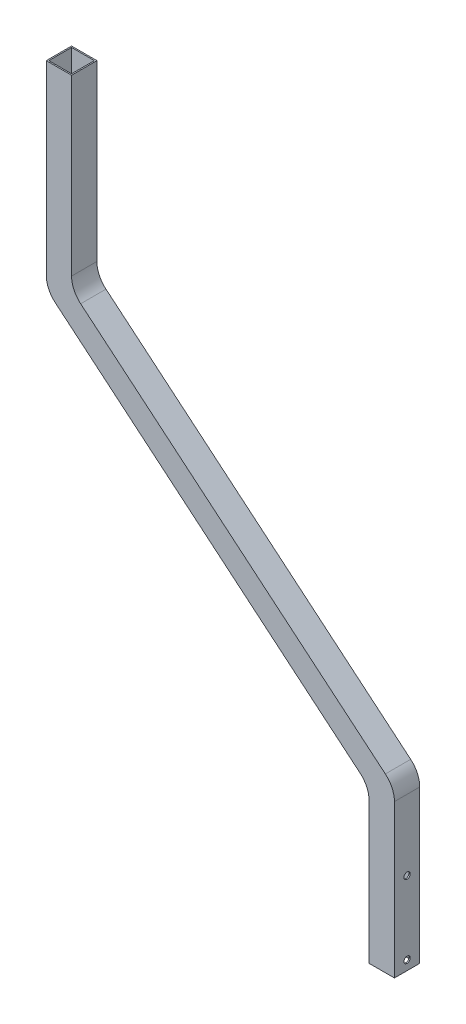
ISO-10303-21;
HEADER;
FILE_DESCRIPTION(('STEP AP214'),'2;1');
FILE_NAME('part.step','',(''),(''),'','','');
FILE_SCHEMA(('AUTOMOTIVE_DESIGN { 1 0 10303 214 1 1 1 1 }'));
ENDSEC;
DATA;
#1=APPLICATION_CONTEXT('core data for automotive mechanical design processes');
#2=APPLICATION_PROTOCOL_DEFINITION('international standard','automotive_design',2000,#1);
#3=PRODUCT_CONTEXT('',#1,'mechanical');
#4=PRODUCT('Part','Part','',(#3));
#5=PRODUCT_RELATED_PRODUCT_CATEGORY('part','',(#4));
#6=PRODUCT_DEFINITION_FORMATION('','',#4);
#7=PRODUCT_DEFINITION_CONTEXT('part definition',#1,'design');
#8=PRODUCT_DEFINITION('design','',#6,#7);
#9=PRODUCT_DEFINITION_SHAPE('','',#8);
#10=(LENGTH_UNIT() NAMED_UNIT(*) SI_UNIT(.MILLI.,.METRE.));
#11=(NAMED_UNIT(*) PLANE_ANGLE_UNIT() SI_UNIT($,.RADIAN.));
#12=(NAMED_UNIT(*) SI_UNIT($,.STERADIAN.) SOLID_ANGLE_UNIT());
#13=UNCERTAINTY_MEASURE_WITH_UNIT(LENGTH_MEASURE(1.E-05),#10,'distance_accuracy_value','');
#14=(GEOMETRIC_REPRESENTATION_CONTEXT(3) GLOBAL_UNCERTAINTY_ASSIGNED_CONTEXT((#13)) GLOBAL_UNIT_ASSIGNED_CONTEXT((#10,
#11,#12)) REPRESENTATION_CONTEXT('',''));
#15=CARTESIAN_POINT('',(0.,0.,0.));
#16=DIRECTION('',(0.,0.,1.));
#17=DIRECTION('',(1.,0.,0.));
#18=AXIS2_PLACEMENT_3D('',#15,#16,#17);
#19=CARTESIAN_POINT('',(-647.7,1244.6,50.8));
#20=DIRECTION('',(0.,-1.,0.));
#21=DIRECTION('',(1.,0.,0.));
#22=AXIS2_PLACEMENT_3D('',#19,#20,#21);
#23=PLANE('',#22);
#24=DIRECTION('',(-1.,0.,0.));
#25=VECTOR('',#24,1.);
#26=CARTESIAN_POINT('',(-647.7,1244.6,0.));
#27=LINE('',#26,#25);
#28=CARTESIAN_POINT('',(-647.7,1244.6,0.));
#29=VERTEX_POINT('',#28);
#30=CARTESIAN_POINT('',(-698.5,1244.6,0.));
#31=VERTEX_POINT('',#30);
#32=EDGE_CURVE('E333',#29,#31,#27,.T.);
#33=ORIENTED_EDGE('',*,*,#32,.T.);
#34=DIRECTION('',(0.,0.,-1.));
#35=VECTOR('',#34,1.);
#36=CARTESIAN_POINT('',(-698.5,1244.6,50.8));
#37=LINE('',#36,#35);
#38=CARTESIAN_POINT('',(-698.5,1244.6,50.8));
#39=VERTEX_POINT('',#38);
#40=EDGE_CURVE('E344',#39,#31,#37,.T.);
#41=ORIENTED_EDGE('',*,*,#40,.F.);
#42=DIRECTION('',(-1.,0.,0.));
#43=VECTOR('',#42,1.);
#44=CARTESIAN_POINT('',(-647.7,1244.6,50.8));
#45=LINE('',#44,#43);
#46=CARTESIAN_POINT('',(-647.7,1244.6,50.8));
#47=VERTEX_POINT('',#46);
#48=EDGE_CURVE('E312',#47,#39,#45,.T.);
#49=ORIENTED_EDGE('',*,*,#48,.F.);
#50=DIRECTION('',(0.,0.,-1.));
#51=VECTOR('',#50,1.);
#52=CARTESIAN_POINT('',(-647.7,1244.6,50.8));
#53=LINE('',#52,#51);
#54=EDGE_CURVE('E347',#47,#29,#53,.T.);
#55=ORIENTED_EDGE('',*,*,#54,.T.);
#56=EDGE_LOOP('',(#33,#41,#49,#55));
#57=FACE_BOUND('',#56,.T.);
#58=DIRECTION('',(-1.,0.,0.));
#59=VECTOR('',#58,1.);
#60=CARTESIAN_POINT('',(-647.7,1244.6,2.54));
#61=LINE('',#60,#59);
#62=CARTESIAN_POINT('',(-650.24,1244.6,2.54));
#63=VERTEX_POINT('',#62);
#64=CARTESIAN_POINT('',(-695.96,1244.6,2.54));
#65=VERTEX_POINT('',#64);
#66=EDGE_CURVE('E282',#63,#65,#61,.T.);
#67=ORIENTED_EDGE('',*,*,#66,.F.);
#68=DIRECTION('',(0.,0.,-1.));
#69=VECTOR('',#68,1.);
#70=CARTESIAN_POINT('',(-650.24,1244.6,50.8));
#71=LINE('',#70,#69);
#72=CARTESIAN_POINT('',(-650.24,1244.6,48.26));
#73=VERTEX_POINT('',#72);
#74=EDGE_CURVE('E293',#73,#63,#71,.T.);
#75=ORIENTED_EDGE('',*,*,#74,.F.);
#76=DIRECTION('',(-1.,0.,0.));
#77=VECTOR('',#76,1.);
#78=CARTESIAN_POINT('',(-647.7,1244.6,48.26));
#79=LINE('',#78,#77);
#80=CARTESIAN_POINT('',(-695.96,1244.6,48.26));
#81=VERTEX_POINT('',#80);
#82=EDGE_CURVE('E61',#73,#81,#79,.T.);
#83=ORIENTED_EDGE('',*,*,#82,.T.);
#84=DIRECTION('',(0.,0.,-1.));
#85=VECTOR('',#84,1.);
#86=CARTESIAN_POINT('',(-695.96,1244.6,50.8));
#87=LINE('',#86,#85);
#88=EDGE_CURVE('E211',#81,#65,#87,.T.);
#89=ORIENTED_EDGE('',*,*,#88,.T.);
#90=EDGE_LOOP('',(#67,#75,#83,#89));
#91=FACE_BOUND('',#90,.T.);
#92=ADVANCED_FACE('F37',(#57,#91),#23,.F.);
#93=CARTESIAN_POINT('',(-50.8,0.,50.8));
#94=DIRECTION('',(0.,1.,0.));
#95=DIRECTION('',(0.,0.,1.));
#96=AXIS2_PLACEMENT_3D('',#93,#94,#95);
#97=PLANE('',#96);
#98=DIRECTION('',(-1.,0.,0.));
#99=VECTOR('',#98,1.);
#100=CARTESIAN_POINT('',(-2.54,0.,48.26));
#101=LINE('',#100,#99);
#102=CARTESIAN_POINT('',(-2.54,0.,48.26));
#103=VERTEX_POINT('',#102);
#104=CARTESIAN_POINT('',(-48.26,0.,48.26));
#105=VERTEX_POINT('',#104);
#106=EDGE_CURVE('E215',#103,#105,#101,.T.);
#107=ORIENTED_EDGE('',*,*,#106,.F.);
#108=DIRECTION('',(0.,0.,1.));
#109=VECTOR('',#108,1.);
#110=CARTESIAN_POINT('',(-2.54,0.,2.54));
#111=LINE('',#110,#109);
#112=CARTESIAN_POINT('',(-2.54,0.,2.54));
#113=VERTEX_POINT('',#112);
#114=EDGE_CURVE('E219',#113,#103,#111,.T.);
#115=ORIENTED_EDGE('',*,*,#114,.F.);
#116=DIRECTION('',(1.,0.,0.));
#117=VECTOR('',#116,1.);
#118=CARTESIAN_POINT('',(-2.54,0.,2.54));
#119=LINE('',#118,#117);
#120=CARTESIAN_POINT('',(-48.26,0.,2.54));
#121=VERTEX_POINT('',#120);
#122=EDGE_CURVE('E224',#121,#113,#119,.T.);
#123=ORIENTED_EDGE('',*,*,#122,.F.);
#124=DIRECTION('',(0.,0.,-1.));
#125=VECTOR('',#124,1.);
#126=CARTESIAN_POINT('',(-48.26,0.,2.54));
#127=LINE('',#126,#125);
#128=EDGE_CURVE('E206',#105,#121,#127,.T.);
#129=ORIENTED_EDGE('',*,*,#128,.F.);
#130=EDGE_LOOP('',(#107,#115,#123,#129));
#131=FACE_BOUND('',#130,.T.);
#132=DIRECTION('',(1.,0.,0.));
#133=VECTOR('',#132,1.);
#134=CARTESIAN_POINT('',(-50.8,0.,0.));
#135=LINE('',#134,#133);
#136=CARTESIAN_POINT('',(-50.8,0.,0.));
#137=VERTEX_POINT('',#136);
#138=CARTESIAN_POINT('',(0.,0.,0.));
#139=VERTEX_POINT('',#138);
#140=EDGE_CURVE('E248',#137,#139,#135,.T.);
#141=ORIENTED_EDGE('',*,*,#140,.T.);
#142=DIRECTION('',(0.,0.,-1.));
#143=VECTOR('',#142,1.);
#144=CARTESIAN_POINT('',(0.,0.,50.8));
#145=LINE('',#144,#143);
#146=CARTESIAN_POINT('',(0.,0.,50.8));
#147=VERTEX_POINT('',#146);
#148=EDGE_CURVE('E350',#147,#139,#145,.T.);
#149=ORIENTED_EDGE('',*,*,#148,.F.);
#150=DIRECTION('',(1.,0.,0.));
#151=VECTOR('',#150,1.);
#152=CARTESIAN_POINT('',(-50.8,0.,50.8));
#153=LINE('',#152,#151);
#154=CARTESIAN_POINT('',(-50.8,0.,50.8));
#155=VERTEX_POINT('',#154);
#156=EDGE_CURVE('E300',#155,#147,#153,.T.);
#157=ORIENTED_EDGE('',*,*,#156,.F.);
#158=DIRECTION('',(0.,0.,-1.));
#159=VECTOR('',#158,1.);
#160=CARTESIAN_POINT('',(-50.8,0.,50.8));
#161=LINE('',#160,#159);
#162=EDGE_CURVE('E322',#155,#137,#161,.T.);
#163=ORIENTED_EDGE('',*,*,#162,.T.);
#164=EDGE_LOOP('',(#141,#149,#157,#163));
#165=FACE_BOUND('',#164,.T.);
#166=ADVANCED_FACE('F221',(#131,#165),#97,.F.);
#167=CARTESIAN_POINT('',(0.,0.,50.8));
#168=DIRECTION('',(-1.,0.,0.));
#169=DIRECTION('',(0.,0.,1.));
#170=AXIS2_PLACEMENT_3D('',#167,#168,#169);
#171=PLANE('',#170);
#172=CARTESIAN_POINT('',(0.,19.05,25.4));
#173=DIRECTION('',(1.,0.,0.));
#174=DIRECTION('',(0.,0.,-1.));
#175=AXIS2_PLACEMENT_3D('',#172,#173,#174);
#176=CIRCLE('',#175,6.34999999999999);
#177=CARTESIAN_POINT('',(0.,19.05,19.05));
#178=VERTEX_POINT('',#177);
#179=EDGE_CURVE('E393',#178,#178,#176,.T.);
#180=ORIENTED_EDGE('',*,*,#179,.F.);
#181=EDGE_LOOP('',(#180));
#182=FACE_BOUND('',#181,.T.);
#183=CARTESIAN_POINT('',(0.,165.1,25.4));
#184=DIRECTION('',(1.,0.,0.));
#185=DIRECTION('',(0.,0.,-1.));
#186=AXIS2_PLACEMENT_3D('',#183,#184,#185);
#187=CIRCLE('',#186,6.34999999999999);
#188=CARTESIAN_POINT('',(0.,165.1,19.05));
#189=VERTEX_POINT('',#188);
#190=EDGE_CURVE('E389',#189,#189,#187,.T.);
#191=ORIENTED_EDGE('',*,*,#190,.F.);
#192=EDGE_LOOP('',(#191));
#193=FACE_BOUND('',#192,.T.);
#194=DIRECTION('',(0.,1.,0.));
#195=VECTOR('',#194,1.);
#196=CARTESIAN_POINT('',(0.,0.,0.));
#197=LINE('',#196,#195);
#198=CARTESIAN_POINT('',(0.,306.461836950665,0.));
#199=VERTEX_POINT('',#198);
#200=EDGE_CURVE('E325',#139,#199,#197,.T.);
#201=ORIENTED_EDGE('',*,*,#200,.T.);
#202=DIRECTION('',(0.,0.,-1.));
#203=VECTOR('',#202,1.);
#204=CARTESIAN_POINT('',(0.,306.461836950665,50.8));
#205=LINE('',#204,#203);
#206=CARTESIAN_POINT('',(0.,306.461836950665,50.8));
#207=VERTEX_POINT('',#206);
#208=EDGE_CURVE('E370',#199,#207,#205,.F.);
#209=ORIENTED_EDGE('',*,*,#208,.T.);
#210=DIRECTION('',(0.,1.,0.));
#211=VECTOR('',#210,1.);
#212=CARTESIAN_POINT('',(0.,0.,50.8));
#213=LINE('',#212,#211);
#214=EDGE_CURVE('E303',#147,#207,#213,.T.);
#215=ORIENTED_EDGE('',*,*,#214,.F.);
#216=ORIENTED_EDGE('',*,*,#148,.T.);
#217=EDGE_LOOP('',(#201,#209,#215,#216));
#218=FACE_BOUND('',#217,.T.);
#219=ADVANCED_FACE('F467',(#182,#193,#218),#171,.F.);
#220=CARTESIAN_POINT('',(0.,330.2,50.8));
#221=DIRECTION('',(-0.641555200491106,-0.76707687015241,0.));
#222=DIRECTION('',(0.76707687015241,-0.641555200491106,0.));
#223=AXIS2_PLACEMENT_3D('',#220,#221,#222);
#224=PLANE('',#223);
#225=DIRECTION('',(-0.76707687015241,0.641555200491106,0.));
#226=VECTOR('',#225,1.);
#227=CARTESIAN_POINT('',(0.,330.2,50.8));
#228=LINE('',#227,#226);
#229=CARTESIAN_POINT('',(-18.2089958150518,345.429341954407,50.8));
#230=VERTEX_POINT('',#229);
#231=CARTESIAN_POINT('',(-629.491004184948,856.68338531832,50.8));
#232=VERTEX_POINT('',#231);
#233=EDGE_CURVE('E307',#230,#232,#228,.T.);
#234=ORIENTED_EDGE('',*,*,#233,.F.);
#235=DIRECTION('',(0.,0.,-1.));
#236=VECTOR('',#235,1.);
#237=CARTESIAN_POINT('',(-18.2089958150518,345.429341954407,50.8));
#238=LINE('',#237,#236);
#239=CARTESIAN_POINT('',(-18.2089958150518,345.429341954407,0.));
#240=VERTEX_POINT('',#239);
#241=EDGE_CURVE('E363',#230,#240,#238,.T.);
#242=ORIENTED_EDGE('',*,*,#241,.T.);
#243=DIRECTION('',(-0.76707687015241,0.641555200491106,0.));
#244=VECTOR('',#243,1.);
#245=CARTESIAN_POINT('',(0.,330.2,0.));
#246=LINE('',#245,#244);
#247=CARTESIAN_POINT('',(-629.491004184948,856.68338531832,0.));
#248=VERTEX_POINT('',#247);
#249=EDGE_CURVE('E328',#240,#248,#246,.T.);
#250=ORIENTED_EDGE('',*,*,#249,.T.);
#251=DIRECTION('',(0.,0.,-1.));
#252=VECTOR('',#251,1.);
#253=CARTESIAN_POINT('',(-629.491004184948,856.68338531832,50.8));
#254=LINE('',#253,#252);
#255=EDGE_CURVE('E361',#248,#232,#254,.F.);
#256=ORIENTED_EDGE('',*,*,#255,.T.);
#257=EDGE_LOOP('',(#234,#242,#250,#256));
#258=FACE_BOUND('',#257,.T.);
#259=ADVANCED_FACE('F476',(#258),#224,.F.);
#260=CARTESIAN_POINT('',(-647.7,871.912727272727,50.8));
#261=DIRECTION('',(-1.,0.,0.));
#262=DIRECTION('',(0.,0.,1.));
#263=AXIS2_PLACEMENT_3D('',#260,#261,#262);
#264=PLANE('',#263);
#265=DIRECTION('',(0.,1.,0.));
#266=VECTOR('',#265,1.);
#267=CARTESIAN_POINT('',(-647.7,871.912727272727,50.8));
#268=LINE('',#267,#266);
#269=CARTESIAN_POINT('',(-647.7,895.650890322063,50.8));
#270=VERTEX_POINT('',#269);
#271=EDGE_CURVE('E310',#270,#47,#268,.T.);
#272=ORIENTED_EDGE('',*,*,#271,.F.);
#273=DIRECTION('',(0.,0.,-1.));
#274=VECTOR('',#273,1.);
#275=CARTESIAN_POINT('',(-647.7,895.650890322063,0.));
#276=LINE('',#275,#274);
#277=CARTESIAN_POINT('',(-647.7,895.650890322063,0.));
#278=VERTEX_POINT('',#277);
#279=EDGE_CURVE('E376',#270,#278,#276,.T.);
#280=ORIENTED_EDGE('',*,*,#279,.T.);
#281=DIRECTION('',(0.,1.,0.));
#282=VECTOR('',#281,1.);
#283=CARTESIAN_POINT('',(-647.7,871.912727272727,0.));
#284=LINE('',#283,#282);
#285=EDGE_CURVE('E331',#278,#29,#284,.T.);
#286=ORIENTED_EDGE('',*,*,#285,.T.);
#287=ORIENTED_EDGE('',*,*,#54,.F.);
#288=EDGE_LOOP('',(#272,#280,#286,#287));
#289=FACE_BOUND('',#288,.T.);
#290=ADVANCED_FACE('F473',(#289),#264,.F.);
#291=CARTESIAN_POINT('',(-698.5,848.174564223392,50.8));
#292=DIRECTION('',(1.,0.,0.));
#293=DIRECTION('',(0.,1.,0.));
#294=AXIS2_PLACEMENT_3D('',#291,#292,#293);
#295=PLANE('',#294);
#296=DIRECTION('',(0.,-1.,0.));
#297=VECTOR('',#296,1.);
#298=CARTESIAN_POINT('',(-698.5,848.174564223392,0.));
#299=LINE('',#298,#297);
#300=CARTESIAN_POINT('',(-698.5,871.912727272727,0.));
#301=VERTEX_POINT('',#300);
#302=EDGE_CURVE('E335',#31,#301,#299,.T.);
#303=ORIENTED_EDGE('',*,*,#302,.T.);
#304=DIRECTION('',(0.,0.,-1.));
#305=VECTOR('',#304,1.);
#306=CARTESIAN_POINT('',(-698.5,871.912727272727,50.8));
#307=LINE('',#306,#305);
#308=CARTESIAN_POINT('',(-698.5,871.912727272727,50.8));
#309=VERTEX_POINT('',#308);
#310=EDGE_CURVE('E379',#301,#309,#307,.F.);
#311=ORIENTED_EDGE('',*,*,#310,.T.);
#312=DIRECTION('',(0.,-1.,0.));
#313=VECTOR('',#312,1.);
#314=CARTESIAN_POINT('',(-698.5,848.174564223392,50.8));
#315=LINE('',#314,#313);
#316=EDGE_CURVE('E314',#39,#309,#315,.T.);
#317=ORIENTED_EDGE('',*,*,#316,.F.);
#318=ORIENTED_EDGE('',*,*,#40,.T.);
#319=EDGE_LOOP('',(#303,#311,#317,#318));
#320=FACE_BOUND('',#319,.T.);
#321=ADVANCED_FACE('F471',(#320),#295,.F.);
#322=CARTESIAN_POINT('',(-50.8,306.461836950665,50.8));
#323=DIRECTION('',(0.641555200491106,0.76707687015241,0.));
#324=DIRECTION('',(-0.76707687015241,0.641555200491106,0.));
#325=AXIS2_PLACEMENT_3D('',#322,#323,#324);
#326=PLANE('',#325);
#327=CARTESIAN_POINT('',(-582.872241675592,751.467711806614,25.4));
#328=DIRECTION('',(-0.641555200491106,-0.76707687015241,0.));
#329=DIRECTION('',(0.76707687015241,-0.641555200491106,0.));
#330=AXIS2_PLACEMENT_3D('',#327,#328,#329);
#331=CIRCLE('',#330,6.34999999999999);
#332=CARTESIAN_POINT('',(-578.001303550124,747.393836283495,25.4));
#333=VERTEX_POINT('',#332);
#334=EDGE_CURVE('E404',#333,#333,#331,.T.);
#335=ORIENTED_EDGE('',*,*,#334,.F.);
#336=EDGE_LOOP('',(#335));
#337=FACE_BOUND('',#336,.T.);
#338=DIRECTION('',(0.76707687015241,-0.641555200491106,0.));
#339=VECTOR('',#338,1.);
#340=CARTESIAN_POINT('',(-50.8,306.461836950665,0.));
#341=LINE('',#340,#339);
#342=CARTESIAN_POINT('',(-680.291004184948,832.945222268984,0.));
#343=VERTEX_POINT('',#342);
#344=CARTESIAN_POINT('',(-69.0089958150519,321.691178905072,0.));
#345=VERTEX_POINT('',#344);
#346=EDGE_CURVE('E338',#343,#345,#341,.T.);
#347=ORIENTED_EDGE('',*,*,#346,.T.);
#348=DIRECTION('',(0.,0.,-1.));
#349=VECTOR('',#348,1.);
#350=CARTESIAN_POINT('',(-69.0089958150518,321.691178905072,50.8));
#351=LINE('',#350,#349);
#352=CARTESIAN_POINT('',(-69.0089958150519,321.691178905072,50.8));
#353=VERTEX_POINT('',#352);
#354=EDGE_CURVE('E359',#345,#353,#351,.F.);
#355=ORIENTED_EDGE('',*,*,#354,.T.);
#356=DIRECTION('',(0.76707687015241,-0.641555200491106,0.));
#357=VECTOR('',#356,1.);
#358=CARTESIAN_POINT('',(-50.8,306.461836950665,50.8));
#359=LINE('',#358,#357);
#360=CARTESIAN_POINT('',(-680.291004184948,832.945222268984,50.8));
#361=VERTEX_POINT('',#360);
#362=EDGE_CURVE('E317',#361,#353,#359,.T.);
#363=ORIENTED_EDGE('',*,*,#362,.F.);
#364=DIRECTION('',(0.,0.,-1.));
#365=VECTOR('',#364,1.);
#366=CARTESIAN_POINT('',(-680.291004184948,832.945222268984,50.8));
#367=LINE('',#366,#365);
#368=EDGE_CURVE('E356',#361,#343,#367,.T.);
#369=ORIENTED_EDGE('',*,*,#368,.T.);
#370=EDGE_LOOP('',(#347,#355,#363,#369));
#371=FACE_BOUND('',#370,.T.);
#372=ADVANCED_FACE('F519',(#337,#371),#326,.F.);
#373=CARTESIAN_POINT('',(-50.8,0.,50.8));
#374=DIRECTION('',(1.,0.,0.));
#375=DIRECTION('',(0.,0.,-1.));
#376=AXIS2_PLACEMENT_3D('',#373,#374,#375);
#377=PLANE('',#376);
#378=CARTESIAN_POINT('',(-50.8,19.05,25.4));
#379=DIRECTION('',(1.,0.,0.));
#380=DIRECTION('',(0.,0.,-1.));
#381=AXIS2_PLACEMENT_3D('',#378,#379,#380);
#382=CIRCLE('',#381,6.34999999999995);
#383=CARTESIAN_POINT('',(-50.8,19.05,19.0500000000001));
#384=VERTEX_POINT('',#383);
#385=EDGE_CURVE('E392',#384,#384,#382,.T.);
#386=ORIENTED_EDGE('',*,*,#385,.T.);
#387=EDGE_LOOP('',(#386));
#388=FACE_BOUND('',#387,.T.);
#389=CARTESIAN_POINT('',(-50.8,165.1,25.4));
#390=DIRECTION('',(1.,0.,0.));
#391=DIRECTION('',(0.,0.,-1.));
#392=AXIS2_PLACEMENT_3D('',#389,#390,#391);
#393=CIRCLE('',#392,6.34999999999995);
#394=CARTESIAN_POINT('',(-50.8,165.1,19.05));
#395=VERTEX_POINT('',#394);
#396=EDGE_CURVE('E413',#395,#395,#393,.T.);
#397=ORIENTED_EDGE('',*,*,#396,.T.);
#398=EDGE_LOOP('',(#397));
#399=FACE_BOUND('',#398,.T.);
#400=DIRECTION('',(0.,-1.,0.));
#401=VECTOR('',#400,1.);
#402=CARTESIAN_POINT('',(-50.8,0.,50.8));
#403=LINE('',#402,#401);
#404=CARTESIAN_POINT('',(-50.8,282.723673901329,50.8));
#405=VERTEX_POINT('',#404);
#406=EDGE_CURVE('E320',#405,#155,#403,.T.);
#407=ORIENTED_EDGE('',*,*,#406,.F.);
#408=DIRECTION('',(0.,0.,-1.));
#409=VECTOR('',#408,1.);
#410=CARTESIAN_POINT('',(-50.8,282.723673901329,0.));
#411=LINE('',#410,#409);
#412=CARTESIAN_POINT('',(-50.8,282.723673901329,0.));
#413=VERTEX_POINT('',#412);
#414=EDGE_CURVE('E353',#405,#413,#411,.T.);
#415=ORIENTED_EDGE('',*,*,#414,.T.);
#416=DIRECTION('',(0.,-1.,0.));
#417=VECTOR('',#416,1.);
#418=CARTESIAN_POINT('',(-50.8,0.,0.));
#419=LINE('',#418,#417);
#420=EDGE_CURVE('E304',#413,#137,#419,.T.);
#421=ORIENTED_EDGE('',*,*,#420,.T.);
#422=ORIENTED_EDGE('',*,*,#162,.F.);
#423=EDGE_LOOP('',(#407,#415,#421,#422));
#424=FACE_BOUND('',#423,.T.);
#425=ADVANCED_FACE('F530',(#388,#399,#424),#377,.F.);
#426=CARTESIAN_POINT('',(0.,0.,50.8));
#427=DIRECTION('',(0.,0.,1.));
#428=DIRECTION('',(1.,0.,0.));
#429=AXIS2_PLACEMENT_3D('',#426,#427,#428);
#430=PLANE('',#429);
#431=ORIENTED_EDGE('',*,*,#214,.T.);
#432=CARTESIAN_POINT('',(-50.8,306.461836950665,50.8));
#433=DIRECTION('',(0.,0.,1.));
#434=DIRECTION('',(1.,0.,0.));
#435=AXIS2_PLACEMENT_3D('',#432,#433,#434);
#436=CIRCLE('',#435,50.8);
#437=EDGE_CURVE('E374',#207,#230,#436,.T.);
#438=ORIENTED_EDGE('',*,*,#437,.T.);
#439=ORIENTED_EDGE('',*,*,#233,.T.);
#440=CARTESIAN_POINT('',(-596.9,895.650890322063,50.8));
#441=DIRECTION('',(0.,0.,1.));
#442=DIRECTION('',(1.,0.,0.));
#443=AXIS2_PLACEMENT_3D('',#440,#441,#442);
#444=CIRCLE('',#443,50.8);
#445=EDGE_CURVE('E11',#232,#270,#444,.F.);
#446=ORIENTED_EDGE('',*,*,#445,.T.);
#447=ORIENTED_EDGE('',*,*,#271,.T.);
#448=ORIENTED_EDGE('',*,*,#48,.T.);
#449=ORIENTED_EDGE('',*,*,#316,.T.);
#450=CARTESIAN_POINT('',(-647.7,871.912727272727,50.8));
#451=DIRECTION('',(0.,0.,1.));
#452=DIRECTION('',(1.,0.,0.));
#453=AXIS2_PLACEMENT_3D('',#450,#451,#452);
#454=CIRCLE('',#453,50.8);
#455=EDGE_CURVE('E372',#309,#361,#454,.T.);
#456=ORIENTED_EDGE('',*,*,#455,.T.);
#457=ORIENTED_EDGE('',*,*,#362,.T.);
#458=CARTESIAN_POINT('',(-101.6,282.723673901329,50.8));
#459=DIRECTION('',(0.,0.,1.));
#460=DIRECTION('',(1.,0.,0.));
#461=AXIS2_PLACEMENT_3D('',#458,#459,#460);
#462=CIRCLE('',#461,50.8);
#463=EDGE_CURVE('E383',#353,#405,#462,.F.);
#464=ORIENTED_EDGE('',*,*,#463,.T.);
#465=ORIENTED_EDGE('',*,*,#406,.T.);
#466=ORIENTED_EDGE('',*,*,#156,.T.);
#467=EDGE_LOOP('',(#431,#438,#439,#446,#447,#448,#449,#456,#457,#464,#465,#466));
#468=FACE_BOUND('',#467,.T.);
#469=ADVANCED_FACE('F504',(#468),#430,.T.);
#470=CARTESIAN_POINT('',(0.,0.,0.));
#471=DIRECTION('',(0.,0.,1.));
#472=DIRECTION('',(1.,0.,0.));
#473=AXIS2_PLACEMENT_3D('',#470,#471,#472);
#474=PLANE('',#473);
#475=ORIENTED_EDGE('',*,*,#249,.F.);
#476=CARTESIAN_POINT('',(-50.8,306.461836950665,0.));
#477=DIRECTION('',(0.,0.,1.));
#478=DIRECTION('',(1.,0.,0.));
#479=AXIS2_PLACEMENT_3D('',#476,#477,#478);
#480=CIRCLE('',#479,50.8);
#481=EDGE_CURVE('E368',#240,#199,#480,.F.);
#482=ORIENTED_EDGE('',*,*,#481,.T.);
#483=ORIENTED_EDGE('',*,*,#200,.F.);
#484=ORIENTED_EDGE('',*,*,#140,.F.);
#485=ORIENTED_EDGE('',*,*,#420,.F.);
#486=CARTESIAN_POINT('',(-101.6,282.723673901329,0.));
#487=DIRECTION('',(0.,0.,1.));
#488=DIRECTION('',(1.,0.,0.));
#489=AXIS2_PLACEMENT_3D('',#486,#487,#488);
#490=CIRCLE('',#489,50.8);
#491=EDGE_CURVE('E381',#413,#345,#490,.T.);
#492=ORIENTED_EDGE('',*,*,#491,.T.);
#493=ORIENTED_EDGE('',*,*,#346,.F.);
#494=CARTESIAN_POINT('',(-647.7,871.912727272727,0.));
#495=DIRECTION('',(0.,0.,1.));
#496=DIRECTION('',(1.,0.,0.));
#497=AXIS2_PLACEMENT_3D('',#494,#495,#496);
#498=CIRCLE('',#497,50.8);
#499=EDGE_CURVE('E366',#343,#301,#498,.F.);
#500=ORIENTED_EDGE('',*,*,#499,.T.);
#501=ORIENTED_EDGE('',*,*,#302,.F.);
#502=ORIENTED_EDGE('',*,*,#32,.F.);
#503=ORIENTED_EDGE('',*,*,#285,.F.);
#504=CARTESIAN_POINT('',(-596.9,895.650890322063,0.));
#505=DIRECTION('',(0.,0.,1.));
#506=DIRECTION('',(1.,0.,0.));
#507=AXIS2_PLACEMENT_3D('',#504,#505,#506);
#508=CIRCLE('',#507,50.8);
#509=EDGE_CURVE('E46',#278,#248,#508,.T.);
#510=ORIENTED_EDGE('',*,*,#509,.T.);
#511=EDGE_LOOP('',(#475,#482,#483,#484,#485,#492,#493,#500,#501,#502,#503,#510));
#512=FACE_BOUND('',#511,.T.);
#513=ADVANCED_FACE('F488',(#512),#474,.F.);
#514=CARTESIAN_POINT('',(-101.6,282.723673901329,50.8));
#515=DIRECTION('',(0.,0.,1.));
#516=DIRECTION('',(1.,0.,0.));
#517=AXIS2_PLACEMENT_3D('',#514,#515,#516);
#518=CYLINDRICAL_SURFACE('',#517,50.8);
#519=ORIENTED_EDGE('',*,*,#463,.F.);
#520=ORIENTED_EDGE('',*,*,#354,.F.);
#521=ORIENTED_EDGE('',*,*,#491,.F.);
#522=ORIENTED_EDGE('',*,*,#414,.F.);
#523=EDGE_LOOP('',(#519,#520,#521,#522));
#524=FACE_BOUND('',#523,.T.);
#525=ADVANCED_FACE('F484',(#524),#518,.F.);
#526=CARTESIAN_POINT('',(-50.8,306.461836950665,50.8));
#527=DIRECTION('',(0.,0.,-1.));
#528=DIRECTION('',(-1.,0.,0.));
#529=AXIS2_PLACEMENT_3D('',#526,#527,#528);
#530=CYLINDRICAL_SURFACE('',#529,50.8);
#531=ORIENTED_EDGE('',*,*,#437,.F.);
#532=ORIENTED_EDGE('',*,*,#208,.F.);
#533=ORIENTED_EDGE('',*,*,#481,.F.);
#534=ORIENTED_EDGE('',*,*,#241,.F.);
#535=EDGE_LOOP('',(#531,#532,#533,#534));
#536=FACE_BOUND('',#535,.T.);
#537=ADVANCED_FACE('F487',(#536),#530,.T.);
#538=CARTESIAN_POINT('',(-596.9,895.650890322063,50.8));
#539=DIRECTION('',(0.,0.,1.));
#540=DIRECTION('',(1.,0.,0.));
#541=AXIS2_PLACEMENT_3D('',#538,#539,#540);
#542=CYLINDRICAL_SURFACE('',#541,50.8);
#543=ORIENTED_EDGE('',*,*,#445,.F.);
#544=ORIENTED_EDGE('',*,*,#255,.F.);
#545=ORIENTED_EDGE('',*,*,#509,.F.);
#546=ORIENTED_EDGE('',*,*,#279,.F.);
#547=EDGE_LOOP('',(#543,#544,#545,#546));
#548=FACE_BOUND('',#547,.T.);
#549=ADVANCED_FACE('F491',(#548),#542,.F.);
#550=CARTESIAN_POINT('',(-647.7,871.912727272727,50.8));
#551=DIRECTION('',(0.,0.,-1.));
#552=DIRECTION('',(-1.,0.,0.));
#553=AXIS2_PLACEMENT_3D('',#550,#551,#552);
#554=CYLINDRICAL_SURFACE('',#553,50.8);
#555=ORIENTED_EDGE('',*,*,#455,.F.);
#556=ORIENTED_EDGE('',*,*,#310,.F.);
#557=ORIENTED_EDGE('',*,*,#499,.F.);
#558=ORIENTED_EDGE('',*,*,#368,.F.);
#559=EDGE_LOOP('',(#555,#556,#557,#558));
#560=FACE_BOUND('',#559,.T.);
#561=ADVANCED_FACE('F39',(#560),#554,.T.);
#562=CARTESIAN_POINT('',(-2.54,0.,50.8));
#563=DIRECTION('',(-1.,0.,0.));
#564=DIRECTION('',(0.,0.,1.));
#565=AXIS2_PLACEMENT_3D('',#562,#563,#564);
#566=PLANE('',#565);
#567=CARTESIAN_POINT('',(-2.54,19.05,25.4));
#568=DIRECTION('',(-1.,0.,0.));
#569=DIRECTION('',(0.,0.,1.));
#570=AXIS2_PLACEMENT_3D('',#567,#568,#569);
#571=CIRCLE('',#570,6.34999999999995);
#572=CARTESIAN_POINT('',(-2.54,19.05,31.7499999999999));
#573=VERTEX_POINT('',#572);
#574=EDGE_CURVE('E390',#573,#573,#571,.T.);
#575=ORIENTED_EDGE('',*,*,#574,.F.);
#576=EDGE_LOOP('',(#575));
#577=FACE_BOUND('',#576,.T.);
#578=CARTESIAN_POINT('',(-2.54,165.1,25.4));
#579=DIRECTION('',(-1.,0.,0.));
#580=DIRECTION('',(0.,0.,1.));
#581=AXIS2_PLACEMENT_3D('',#578,#579,#580);
#582=CIRCLE('',#581,6.34999999999995);
#583=CARTESIAN_POINT('',(-2.54,165.1,31.75));
#584=VERTEX_POINT('',#583);
#585=EDGE_CURVE('E386',#584,#584,#582,.T.);
#586=ORIENTED_EDGE('',*,*,#585,.F.);
#587=EDGE_LOOP('',(#586));
#588=FACE_BOUND('',#587,.T.);
#589=DIRECTION('',(0.,1.,0.));
#590=VECTOR('',#589,1.);
#591=CARTESIAN_POINT('',(-2.54,0.,48.26));
#592=LINE('',#591,#590);
#593=CARTESIAN_POINT('',(-2.54,306.461836950665,48.26));
#594=VERTEX_POINT('',#593);
#595=EDGE_CURVE('E54',#103,#594,#592,.T.);
#596=ORIENTED_EDGE('',*,*,#595,.T.);
#597=DIRECTION('',(0.,0.,1.));
#598=VECTOR('',#597,1.);
#599=CARTESIAN_POINT('',(-2.54,306.461836950665,50.8));
#600=LINE('',#599,#598);
#601=CARTESIAN_POINT('',(-2.54,306.461836950665,2.54));
#602=VERTEX_POINT('',#601);
#603=EDGE_CURVE('E232',#602,#594,#600,.T.);
#604=ORIENTED_EDGE('',*,*,#603,.F.);
#605=DIRECTION('',(0.,1.,0.));
#606=VECTOR('',#605,1.);
#607=CARTESIAN_POINT('',(-2.54,0.,2.54));
#608=LINE('',#607,#606);
#609=EDGE_CURVE('E226',#113,#602,#608,.T.);
#610=ORIENTED_EDGE('',*,*,#609,.F.);
#611=ORIENTED_EDGE('',*,*,#114,.T.);
#612=EDGE_LOOP('',(#596,#604,#610,#611));
#613=FACE_BOUND('',#612,.T.);
#614=ADVANCED_FACE('F416',(#577,#588,#613),#566,.T.);
#615=CARTESIAN_POINT('',(-1.62955020924741,328.251624749813,50.8));
#616=DIRECTION('',(-0.641555200491106,-0.76707687015241,0.));
#617=DIRECTION('',(0.76707687015241,-0.641555200491106,0.));
#618=AXIS2_PLACEMENT_3D('',#615,#616,#617);
#619=PLANE('',#618);
#620=DIRECTION('',(-0.76707687015241,0.641555200491106,0.));
#621=VECTOR('',#620,1.);
#622=CARTESIAN_POINT('',(-1.62955020924741,328.251624749813,48.26));
#623=LINE('',#622,#621);
#624=CARTESIAN_POINT('',(-19.8385460242992,343.48096670422,48.26));
#625=VERTEX_POINT('',#624);
#626=CARTESIAN_POINT('',(-631.120554394196,854.735010068133,48.26));
#627=VERTEX_POINT('',#626);
#628=EDGE_CURVE('E238',#625,#627,#623,.T.);
#629=ORIENTED_EDGE('',*,*,#628,.T.);
#630=DIRECTION('',(0.,0.,1.));
#631=VECTOR('',#630,1.);
#632=CARTESIAN_POINT('',(-631.120554394196,854.735010068133,50.8));
#633=LINE('',#632,#631);
#634=CARTESIAN_POINT('',(-631.120554394196,854.735010068133,2.54));
#635=VERTEX_POINT('',#634);
#636=EDGE_CURVE('E264',#635,#627,#633,.T.);
#637=ORIENTED_EDGE('',*,*,#636,.F.);
#638=DIRECTION('',(-0.76707687015241,0.641555200491106,0.));
#639=VECTOR('',#638,1.);
#640=CARTESIAN_POINT('',(-1.62955020924741,328.251624749813,2.54));
#641=LINE('',#640,#639);
#642=CARTESIAN_POINT('',(-19.8385460242992,343.48096670422,2.54));
#643=VERTEX_POINT('',#642);
#644=EDGE_CURVE('E231',#643,#635,#641,.T.);
#645=ORIENTED_EDGE('',*,*,#644,.F.);
#646=DIRECTION('',(0.,0.,1.));
#647=VECTOR('',#646,1.);
#648=CARTESIAN_POINT('',(-19.8385460242992,343.48096670422,50.8));
#649=LINE('',#648,#647);
#650=EDGE_CURVE('E260',#625,#643,#649,.F.);
#651=ORIENTED_EDGE('',*,*,#650,.F.);
#652=EDGE_LOOP('',(#629,#637,#645,#651));
#653=FACE_BOUND('',#652,.T.);
#654=ADVANCED_FACE('F450',(#653),#619,.T.);
#655=CARTESIAN_POINT('',(-650.24,871.912727272727,50.8));
#656=DIRECTION('',(-1.,0.,0.));
#657=DIRECTION('',(0.,0.,1.));
#658=AXIS2_PLACEMENT_3D('',#655,#656,#657);
#659=PLANE('',#658);
#660=DIRECTION('',(0.,1.,0.));
#661=VECTOR('',#660,1.);
#662=CARTESIAN_POINT('',(-650.24,871.912727272727,48.26));
#663=LINE('',#662,#661);
#664=CARTESIAN_POINT('',(-650.24,895.650890322063,48.26));
#665=VERTEX_POINT('',#664);
#666=EDGE_CURVE('E245',#665,#73,#663,.T.);
#667=ORIENTED_EDGE('',*,*,#666,.T.);
#668=ORIENTED_EDGE('',*,*,#74,.T.);
#669=DIRECTION('',(0.,1.,0.));
#670=VECTOR('',#669,1.);
#671=CARTESIAN_POINT('',(-650.24,871.912727272727,2.54));
#672=LINE('',#671,#670);
#673=CARTESIAN_POINT('',(-650.24,895.650890322063,2.54));
#674=VERTEX_POINT('',#673);
#675=EDGE_CURVE('E267',#674,#63,#672,.T.);
#676=ORIENTED_EDGE('',*,*,#675,.F.);
#677=DIRECTION('',(0.,0.,1.));
#678=VECTOR('',#677,1.);
#679=CARTESIAN_POINT('',(-650.24,895.650890322063,50.8));
#680=LINE('',#679,#678);
#681=EDGE_CURVE('E242',#665,#674,#680,.F.);
#682=ORIENTED_EDGE('',*,*,#681,.F.);
#683=EDGE_LOOP('',(#667,#668,#676,#682));
#684=FACE_BOUND('',#683,.T.);
#685=ADVANCED_FACE('F440',(#684),#659,.T.);
#686=CARTESIAN_POINT('',(-695.96,848.174564223392,50.8));
#687=DIRECTION('',(1.,0.,0.));
#688=DIRECTION('',(0.,1.,0.));
#689=AXIS2_PLACEMENT_3D('',#686,#687,#688);
#690=PLANE('',#689);
#691=DIRECTION('',(0.,-1.,0.));
#692=VECTOR('',#691,1.);
#693=CARTESIAN_POINT('',(-695.96,848.174564223392,2.54));
#694=LINE('',#693,#692);
#695=CARTESIAN_POINT('',(-695.96,871.912727272727,2.54));
#696=VERTEX_POINT('',#695);
#697=EDGE_CURVE('E278',#65,#696,#694,.T.);
#698=ORIENTED_EDGE('',*,*,#697,.F.);
#699=ORIENTED_EDGE('',*,*,#88,.F.);
#700=DIRECTION('',(0.,-1.,0.));
#701=VECTOR('',#700,1.);
#702=CARTESIAN_POINT('',(-695.96,848.174564223392,48.26));
#703=LINE('',#702,#701);
#704=CARTESIAN_POINT('',(-695.96,871.912727272727,48.26));
#705=VERTEX_POINT('',#704);
#706=EDGE_CURVE('E251',#81,#705,#703,.T.);
#707=ORIENTED_EDGE('',*,*,#706,.T.);
#708=DIRECTION('',(0.,0.,1.));
#709=VECTOR('',#708,1.);
#710=CARTESIAN_POINT('',(-695.96,871.912727272727,50.8));
#711=LINE('',#710,#709);
#712=EDGE_CURVE('E275',#696,#705,#711,.T.);
#713=ORIENTED_EDGE('',*,*,#712,.F.);
#714=EDGE_LOOP('',(#698,#699,#707,#713));
#715=FACE_BOUND('',#714,.T.);
#716=ADVANCED_FACE('F434',(#715),#690,.T.);
#717=CARTESIAN_POINT('',(-49.1704497907526,308.410212200852,50.8));
#718=DIRECTION('',(0.641555200491106,0.76707687015241,0.));
#719=DIRECTION('',(-0.76707687015241,0.641555200491106,0.));
#720=AXIS2_PLACEMENT_3D('',#717,#718,#719);
#721=PLANE('',#720);
#722=CARTESIAN_POINT('',(-581.242691466345,753.416087056801,25.4));
#723=DIRECTION('',(0.641555200491106,0.76707687015241,0.));
#724=DIRECTION('',(-0.76707687015241,0.641555200491106,0.));
#725=AXIS2_PLACEMENT_3D('',#722,#723,#724);
#726=CIRCLE('',#725,6.34999999999995);
#727=CARTESIAN_POINT('',(-586.113629591812,757.489962579919,25.4));
#728=VERTEX_POINT('',#727);
#729=EDGE_CURVE('E41',#728,#728,#726,.T.);
#730=ORIENTED_EDGE('',*,*,#729,.F.);
#731=EDGE_LOOP('',(#730));
#732=FACE_BOUND('',#731,.T.);
#733=DIRECTION('',(0.76707687015241,-0.641555200491106,0.));
#734=VECTOR('',#733,1.);
#735=CARTESIAN_POINT('',(-49.1704497907526,308.410212200852,2.54));
#736=LINE('',#735,#734);
#737=CARTESIAN_POINT('',(-678.661453975701,834.893597519172,2.54));
#738=VERTEX_POINT('',#737);
#739=CARTESIAN_POINT('',(-67.3794456058045,323.639554155259,2.54));
#740=VERTEX_POINT('',#739);
#741=EDGE_CURVE('E273',#738,#740,#736,.T.);
#742=ORIENTED_EDGE('',*,*,#741,.F.);
#743=DIRECTION('',(0.,0.,1.));
#744=VECTOR('',#743,1.);
#745=CARTESIAN_POINT('',(-678.661453975701,834.893597519172,50.8));
#746=LINE('',#745,#744);
#747=CARTESIAN_POINT('',(-678.661453975701,834.893597519172,48.26));
#748=VERTEX_POINT('',#747);
#749=EDGE_CURVE('E288',#748,#738,#746,.F.);
#750=ORIENTED_EDGE('',*,*,#749,.F.);
#751=DIRECTION('',(0.76707687015241,-0.641555200491106,0.));
#752=VECTOR('',#751,1.);
#753=CARTESIAN_POINT('',(-49.1704497907526,308.410212200852,48.26));
#754=LINE('',#753,#752);
#755=CARTESIAN_POINT('',(-67.3794456058045,323.639554155259,48.26));
#756=VERTEX_POINT('',#755);
#757=EDGE_CURVE('E212',#748,#756,#754,.T.);
#758=ORIENTED_EDGE('',*,*,#757,.T.);
#759=DIRECTION('',(0.,0.,1.));
#760=VECTOR('',#759,1.);
#761=CARTESIAN_POINT('',(-67.3794456058045,323.639554155259,50.8));
#762=LINE('',#761,#760);
#763=EDGE_CURVE('E269',#740,#756,#762,.T.);
#764=ORIENTED_EDGE('',*,*,#763,.F.);
#765=EDGE_LOOP('',(#742,#750,#758,#764));
#766=FACE_BOUND('',#765,.T.);
#767=ADVANCED_FACE('F428',(#732,#766),#721,.T.);
#768=CARTESIAN_POINT('',(-48.26,0.,50.8));
#769=DIRECTION('',(1.,0.,0.));
#770=DIRECTION('',(0.,0.,-1.));
#771=AXIS2_PLACEMENT_3D('',#768,#769,#770);
#772=PLANE('',#771);
#773=CARTESIAN_POINT('',(-48.26,19.05,25.4));
#774=DIRECTION('',(1.,0.,0.));
#775=DIRECTION('',(0.,0.,-1.));
#776=AXIS2_PLACEMENT_3D('',#773,#774,#775);
#777=CIRCLE('',#776,6.34999999999995);
#778=CARTESIAN_POINT('',(-48.26,19.05,19.0500000000001));
#779=VERTEX_POINT('',#778);
#780=EDGE_CURVE('E397',#779,#779,#777,.T.);
#781=ORIENTED_EDGE('',*,*,#780,.F.);
#782=EDGE_LOOP('',(#781));
#783=FACE_BOUND('',#782,.T.);
#784=CARTESIAN_POINT('',(-48.26,165.1,25.4));
#785=DIRECTION('',(1.,0.,0.));
#786=DIRECTION('',(0.,0.,-1.));
#787=AXIS2_PLACEMENT_3D('',#784,#785,#786);
#788=CIRCLE('',#787,6.34999999999995);
#789=CARTESIAN_POINT('',(-48.26,165.1,19.05));
#790=VERTEX_POINT('',#789);
#791=EDGE_CURVE('E388',#790,#790,#788,.T.);
#792=ORIENTED_EDGE('',*,*,#791,.F.);
#793=EDGE_LOOP('',(#792));
#794=FACE_BOUND('',#793,.T.);
#795=ORIENTED_EDGE('',*,*,#128,.T.);
#796=DIRECTION('',(0.,-1.,0.));
#797=VECTOR('',#796,1.);
#798=CARTESIAN_POINT('',(-48.26,0.,2.54));
#799=LINE('',#798,#797);
#800=CARTESIAN_POINT('',(-48.26,282.723673901329,2.54));
#801=VERTEX_POINT('',#800);
#802=EDGE_CURVE('E239',#801,#121,#799,.T.);
#803=ORIENTED_EDGE('',*,*,#802,.F.);
#804=DIRECTION('',(0.,0.,-1.));
#805=VECTOR('',#804,1.);
#806=CARTESIAN_POINT('',(-48.26,282.723673901329,50.8));
#807=LINE('',#806,#805);
#808=CARTESIAN_POINT('',(-48.26,282.723673901329,48.26));
#809=VERTEX_POINT('',#808);
#810=EDGE_CURVE('E209',#809,#801,#807,.T.);
#811=ORIENTED_EDGE('',*,*,#810,.F.);
#812=DIRECTION('',(0.,-1.,0.));
#813=VECTOR('',#812,1.);
#814=CARTESIAN_POINT('',(-48.26,0.,48.26));
#815=LINE('',#814,#813);
#816=EDGE_CURVE('E202',#809,#105,#815,.T.);
#817=ORIENTED_EDGE('',*,*,#816,.T.);
#818=EDGE_LOOP('',(#795,#803,#811,#817));
#819=FACE_BOUND('',#818,.T.);
#820=ADVANCED_FACE('F203',(#783,#794,#819),#772,.T.);
#821=CARTESIAN_POINT('',(0.,0.,48.26));
#822=DIRECTION('',(0.,0.,1.));
#823=DIRECTION('',(1.,0.,0.));
#824=AXIS2_PLACEMENT_3D('',#821,#822,#823);
#825=PLANE('',#824);
#826=ORIENTED_EDGE('',*,*,#106,.T.);
#827=ORIENTED_EDGE('',*,*,#816,.F.);
#828=CARTESIAN_POINT('',(-101.6,282.723673901329,48.26));
#829=DIRECTION('',(0.,0.,1.));
#830=DIRECTION('',(1.,0.,0.));
#831=AXIS2_PLACEMENT_3D('',#828,#829,#830);
#832=CIRCLE('',#831,53.34);
#833=EDGE_CURVE('E257',#756,#809,#832,.F.);
#834=ORIENTED_EDGE('',*,*,#833,.F.);
#835=ORIENTED_EDGE('',*,*,#757,.F.);
#836=CARTESIAN_POINT('',(-647.7,871.912727272727,48.26));
#837=DIRECTION('',(0.,0.,1.));
#838=DIRECTION('',(1.,0.,0.));
#839=AXIS2_PLACEMENT_3D('',#836,#837,#838);
#840=CIRCLE('',#839,48.26);
#841=EDGE_CURVE('E235',#705,#748,#840,.T.);
#842=ORIENTED_EDGE('',*,*,#841,.F.);
#843=ORIENTED_EDGE('',*,*,#706,.F.);
#844=ORIENTED_EDGE('',*,*,#82,.F.);
#845=ORIENTED_EDGE('',*,*,#666,.F.);
#846=CARTESIAN_POINT('',(-596.9,895.650890322063,48.26));
#847=DIRECTION('',(0.,0.,1.));
#848=DIRECTION('',(1.,0.,0.));
#849=AXIS2_PLACEMENT_3D('',#846,#847,#848);
#850=CIRCLE('',#849,53.34);
#851=EDGE_CURVE('E246',#627,#665,#850,.F.);
#852=ORIENTED_EDGE('',*,*,#851,.F.);
#853=ORIENTED_EDGE('',*,*,#628,.F.);
#854=CARTESIAN_POINT('',(-50.8,306.461836950665,48.26));
#855=DIRECTION('',(0.,0.,1.));
#856=DIRECTION('',(1.,0.,0.));
#857=AXIS2_PLACEMENT_3D('',#854,#855,#856);
#858=CIRCLE('',#857,48.26);
#859=EDGE_CURVE('E240',#594,#625,#858,.T.);
#860=ORIENTED_EDGE('',*,*,#859,.F.);
#861=ORIENTED_EDGE('',*,*,#595,.F.);
#862=EDGE_LOOP('',(#826,#827,#834,#835,#842,#843,#844,#845,#852,#853,#860,#861));
#863=FACE_BOUND('',#862,.T.);
#864=ADVANCED_FACE('F216',(#863),#825,.F.);
#865=CARTESIAN_POINT('',(0.,0.,2.54));
#866=DIRECTION('',(0.,0.,1.));
#867=DIRECTION('',(1.,0.,0.));
#868=AXIS2_PLACEMENT_3D('',#865,#866,#867);
#869=PLANE('',#868);
#870=ORIENTED_EDGE('',*,*,#609,.T.);
#871=CARTESIAN_POINT('',(-50.8,306.461836950665,2.54));
#872=DIRECTION('',(0.,0.,1.));
#873=DIRECTION('',(1.,0.,0.));
#874=AXIS2_PLACEMENT_3D('',#871,#872,#873);
#875=CIRCLE('',#874,48.26);
#876=EDGE_CURVE('E236',#643,#602,#875,.F.);
#877=ORIENTED_EDGE('',*,*,#876,.F.);
#878=ORIENTED_EDGE('',*,*,#644,.T.);
#879=CARTESIAN_POINT('',(-596.9,895.650890322063,2.54));
#880=DIRECTION('',(0.,0.,1.));
#881=DIRECTION('',(1.,0.,0.));
#882=AXIS2_PLACEMENT_3D('',#879,#880,#881);
#883=CIRCLE('',#882,53.34);
#884=EDGE_CURVE('E249',#674,#635,#883,.T.);
#885=ORIENTED_EDGE('',*,*,#884,.F.);
#886=ORIENTED_EDGE('',*,*,#675,.T.);
#887=ORIENTED_EDGE('',*,*,#66,.T.);
#888=ORIENTED_EDGE('',*,*,#697,.T.);
#889=CARTESIAN_POINT('',(-647.7,871.912727272727,2.54));
#890=DIRECTION('',(0.,0.,1.));
#891=DIRECTION('',(1.,0.,0.));
#892=AXIS2_PLACEMENT_3D('',#889,#890,#891);
#893=CIRCLE('',#892,48.26);
#894=EDGE_CURVE('E263',#738,#696,#893,.F.);
#895=ORIENTED_EDGE('',*,*,#894,.F.);
#896=ORIENTED_EDGE('',*,*,#741,.T.);
#897=CARTESIAN_POINT('',(-101.6,282.723673901329,2.54));
#898=DIRECTION('',(0.,0.,1.));
#899=DIRECTION('',(1.,0.,0.));
#900=AXIS2_PLACEMENT_3D('',#897,#898,#899);
#901=CIRCLE('',#900,53.34);
#902=EDGE_CURVE('E258',#801,#740,#901,.T.);
#903=ORIENTED_EDGE('',*,*,#902,.F.);
#904=ORIENTED_EDGE('',*,*,#802,.T.);
#905=ORIENTED_EDGE('',*,*,#122,.T.);
#906=EDGE_LOOP('',(#870,#877,#878,#885,#886,#887,#888,#895,#896,#903,#904,#905));
#907=FACE_BOUND('',#906,.T.);
#908=ADVANCED_FACE('F419',(#907),#869,.T.);
#909=CARTESIAN_POINT('',(-101.6,282.723673901329,50.8));
#910=DIRECTION('',(0.,0.,1.));
#911=DIRECTION('',(1.,0.,0.));
#912=AXIS2_PLACEMENT_3D('',#909,#910,#911);
#913=CYLINDRICAL_SURFACE('',#912,53.34);
#914=ORIENTED_EDGE('',*,*,#833,.T.);
#915=ORIENTED_EDGE('',*,*,#810,.T.);
#916=ORIENTED_EDGE('',*,*,#902,.T.);
#917=ORIENTED_EDGE('',*,*,#763,.T.);
#918=EDGE_LOOP('',(#914,#915,#916,#917));
#919=FACE_BOUND('',#918,.T.);
#920=ADVANCED_FACE('F423',(#919),#913,.T.);
#921=CARTESIAN_POINT('',(-50.8,306.461836950665,50.8));
#922=DIRECTION('',(0.,0.,-1.));
#923=DIRECTION('',(-1.,0.,0.));
#924=AXIS2_PLACEMENT_3D('',#921,#922,#923);
#925=CYLINDRICAL_SURFACE('',#924,48.26);
#926=ORIENTED_EDGE('',*,*,#859,.T.);
#927=ORIENTED_EDGE('',*,*,#650,.T.);
#928=ORIENTED_EDGE('',*,*,#876,.T.);
#929=ORIENTED_EDGE('',*,*,#603,.T.);
#930=EDGE_LOOP('',(#926,#927,#928,#929));
#931=FACE_BOUND('',#930,.T.);
#932=ADVANCED_FACE('F452',(#931),#925,.F.);
#933=CARTESIAN_POINT('',(-596.9,895.650890322063,50.8));
#934=DIRECTION('',(0.,0.,1.));
#935=DIRECTION('',(1.,0.,0.));
#936=AXIS2_PLACEMENT_3D('',#933,#934,#935);
#937=CYLINDRICAL_SURFACE('',#936,53.34);
#938=ORIENTED_EDGE('',*,*,#851,.T.);
#939=ORIENTED_EDGE('',*,*,#681,.T.);
#940=ORIENTED_EDGE('',*,*,#884,.T.);
#941=ORIENTED_EDGE('',*,*,#636,.T.);
#942=EDGE_LOOP('',(#938,#939,#940,#941));
#943=FACE_BOUND('',#942,.T.);
#944=ADVANCED_FACE('F446',(#943),#937,.T.);
#945=CARTESIAN_POINT('',(-647.7,871.912727272727,50.8));
#946=DIRECTION('',(0.,0.,-1.));
#947=DIRECTION('',(-1.,0.,0.));
#948=AXIS2_PLACEMENT_3D('',#945,#946,#947);
#949=CYLINDRICAL_SURFACE('',#948,48.26);
#950=ORIENTED_EDGE('',*,*,#841,.T.);
#951=ORIENTED_EDGE('',*,*,#749,.T.);
#952=ORIENTED_EDGE('',*,*,#894,.T.);
#953=ORIENTED_EDGE('',*,*,#712,.T.);
#954=EDGE_LOOP('',(#950,#951,#952,#953));
#955=FACE_BOUND('',#954,.T.);
#956=ADVANCED_FACE('F430',(#955),#949,.F.);
#957=CARTESIAN_POINT('',(0.,165.1,25.4));
#958=DIRECTION('',(1.,0.,0.));
#959=DIRECTION('',(0.,0.,-1.));
#960=AXIS2_PLACEMENT_3D('',#957,#958,#959);
#961=CYLINDRICAL_SURFACE('',#960,6.34999999999995);
#962=ORIENTED_EDGE('',*,*,#585,.T.);
#963=EDGE_LOOP('',(#962));
#964=FACE_BOUND('',#963,.T.);
#965=ORIENTED_EDGE('',*,*,#190,.T.);
#966=EDGE_LOOP('',(#965));
#967=FACE_BOUND('',#966,.T.);
#968=ADVANCED_FACE('F555',(#964,#967),#961,.F.);
#969=ORIENTED_EDGE('',*,*,#791,.T.);
#970=EDGE_LOOP('',(#969));
#971=FACE_BOUND('',#970,.T.);
#972=ORIENTED_EDGE('',*,*,#396,.F.);
#973=EDGE_LOOP('',(#972));
#974=FACE_BOUND('',#973,.T.);
#975=ADVANCED_FACE('F559',(#971,#974),#961,.F.);
#976=CARTESIAN_POINT('',(0.,19.05,25.4));
#977=DIRECTION('',(1.,0.,0.));
#978=DIRECTION('',(0.,0.,-1.));
#979=AXIS2_PLACEMENT_3D('',#976,#977,#978);
#980=CYLINDRICAL_SURFACE('',#979,6.34999999999995);
#981=ORIENTED_EDGE('',*,*,#574,.T.);
#982=EDGE_LOOP('',(#981));
#983=FACE_BOUND('',#982,.T.);
#984=ORIENTED_EDGE('',*,*,#179,.T.);
#985=EDGE_LOOP('',(#984));
#986=FACE_BOUND('',#985,.T.);
#987=ADVANCED_FACE('F565',(#983,#986),#980,.F.);
#988=ORIENTED_EDGE('',*,*,#780,.T.);
#989=EDGE_LOOP('',(#988));
#990=FACE_BOUND('',#989,.T.);
#991=ORIENTED_EDGE('',*,*,#385,.F.);
#992=EDGE_LOOP('',(#991));
#993=FACE_BOUND('',#992,.T.);
#994=ADVANCED_FACE('F660',(#990,#993),#980,.F.);
#995=CARTESIAN_POINT('',(-582.872241675592,751.467711806614,25.4));
#996=DIRECTION('',(-0.641555200491106,-0.76707687015241,0.));
#997=DIRECTION('',(0.76707687015241,-0.641555200491106,0.));
#998=AXIS2_PLACEMENT_3D('',#995,#996,#997);
#999=CYLINDRICAL_SURFACE('',#998,6.34999999999995);
#1000=ORIENTED_EDGE('',*,*,#729,.T.);
#1001=EDGE_LOOP('',(#1000));
#1002=FACE_BOUND('',#1001,.T.);
#1003=ORIENTED_EDGE('',*,*,#334,.T.);
#1004=EDGE_LOOP('',(#1003));
#1005=FACE_BOUND('',#1004,.T.);
#1006=ADVANCED_FACE('F667',(#1002,#1005),#999,.F.);
#1007=CLOSED_SHELL('',(#92,#166,#219,#259,#290,#321,#372,#425,#469,#513,#525,#537,#549,#561,
#614,#654,#685,#716,#767,#820,#864,#908,#920,#932,#944,#956,#968,#975,#987,#994,#1006));
#1008=MANIFOLD_SOLID_BREP('B2',#1007);
#1009=ADVANCED_BREP_SHAPE_REPRESENTATION('',(#18,#1008),#14);
#1010=SHAPE_DEFINITION_REPRESENTATION(#9,#1009);
ENDSEC;
END-ISO-10303-21;
